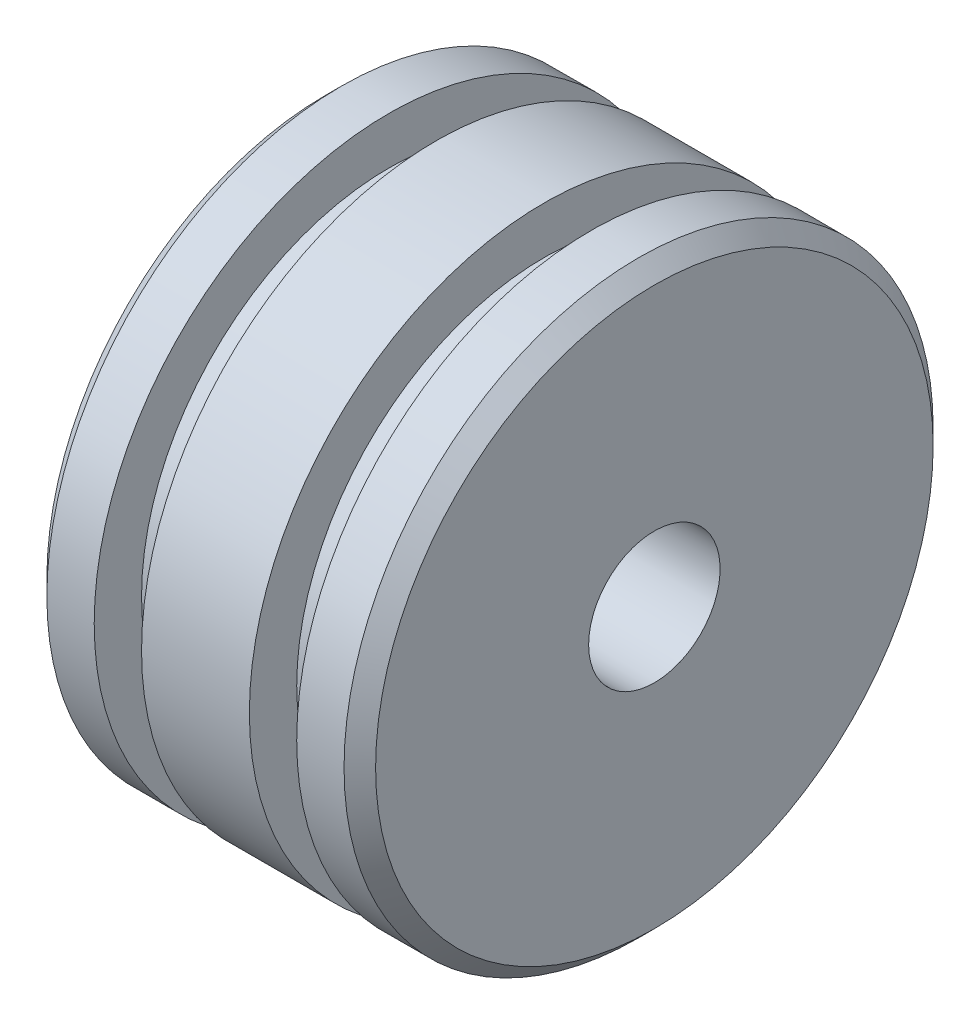
ISO-10303-21;
HEADER;
FILE_DESCRIPTION(('STEP AP214'),'2;1');
FILE_NAME('part.step','',(''),(''),'','','');
FILE_SCHEMA(('AUTOMOTIVE_DESIGN { 1 0 10303 214 1 1 1 1 }'));
ENDSEC;
DATA;
#1=APPLICATION_CONTEXT('core data for automotive mechanical design processes');
#2=APPLICATION_PROTOCOL_DEFINITION('international standard','automotive_design',2000,#1);
#3=PRODUCT_CONTEXT('',#1,'mechanical');
#4=PRODUCT('Part','Part','',(#3));
#5=PRODUCT_RELATED_PRODUCT_CATEGORY('part','',(#4));
#6=PRODUCT_DEFINITION_FORMATION('','',#4);
#7=PRODUCT_DEFINITION_CONTEXT('part definition',#1,'design');
#8=PRODUCT_DEFINITION('design','',#6,#7);
#9=PRODUCT_DEFINITION_SHAPE('','',#8);
#10=(LENGTH_UNIT() NAMED_UNIT(*) SI_UNIT(.MILLI.,.METRE.));
#11=(NAMED_UNIT(*) PLANE_ANGLE_UNIT() SI_UNIT($,.RADIAN.));
#12=(NAMED_UNIT(*) SI_UNIT($,.STERADIAN.) SOLID_ANGLE_UNIT());
#13=UNCERTAINTY_MEASURE_WITH_UNIT(LENGTH_MEASURE(1.E-05),#10,'distance_accuracy_value','');
#14=(GEOMETRIC_REPRESENTATION_CONTEXT(3) GLOBAL_UNCERTAINTY_ASSIGNED_CONTEXT((#13)) GLOBAL_UNIT_ASSIGNED_CONTEXT((#10,
#11,#12)) REPRESENTATION_CONTEXT('',''));
#15=CARTESIAN_POINT('',(0.,0.,0.));
#16=DIRECTION('',(0.,0.,1.));
#17=DIRECTION('',(1.,0.,0.));
#18=AXIS2_PLACEMENT_3D('',#15,#16,#17);
#19=CARTESIAN_POINT('',(15.875,0.,0.));
#20=DIRECTION('',(-1.,0.,0.));
#21=DIRECTION('',(0.,0.,1.));
#22=AXIS2_PLACEMENT_3D('',#19,#20,#21);
#23=CYLINDRICAL_SURFACE('',#22,14.224);
#24=CARTESIAN_POINT('',(5.334,0.,0.));
#25=DIRECTION('',(-1.,0.,0.));
#26=DIRECTION('',(0.,0.,1.));
#27=AXIS2_PLACEMENT_3D('',#24,#25,#26);
#28=CIRCLE('',#27,14.224);
#29=CARTESIAN_POINT('',(5.334,0.,14.224));
#30=VERTEX_POINT('',#29);
#31=EDGE_CURVE('E62',#30,#30,#28,.T.);
#32=ORIENTED_EDGE('',*,*,#31,.F.);
#33=EDGE_LOOP('',(#32));
#34=FACE_BOUND('',#33,.T.);
#35=CARTESIAN_POINT('',(10.541,0.,0.));
#36=DIRECTION('',(-1.,0.,0.));
#37=DIRECTION('',(0.,0.,1.));
#38=AXIS2_PLACEMENT_3D('',#35,#36,#37);
#39=CIRCLE('',#38,14.224);
#40=CARTESIAN_POINT('',(10.541,0.,14.224));
#41=VERTEX_POINT('',#40);
#42=EDGE_CURVE('E72',#41,#41,#39,.T.);
#43=ORIENTED_EDGE('',*,*,#42,.T.);
#44=EDGE_LOOP('',(#43));
#45=FACE_BOUND('',#44,.T.);
#46=ADVANCED_FACE('F32',(#34,#45),#23,.T.);
#47=CARTESIAN_POINT('',(0.762000000000013,0.,0.));
#48=DIRECTION('',(1.,0.,0.));
#49=DIRECTION('',(0.,0.,-1.));
#50=AXIS2_PLACEMENT_3D('',#47,#48,#49);
#51=CIRCLE('',#50,14.224);
#52=CARTESIAN_POINT('',(0.762000000000013,0.,-14.224));
#53=VERTEX_POINT('',#52);
#54=EDGE_CURVE('E40',#53,#53,#51,.T.);
#55=ORIENTED_EDGE('',*,*,#54,.T.);
#56=EDGE_LOOP('',(#55));
#57=FACE_BOUND('',#56,.T.);
#58=CARTESIAN_POINT('',(3.048,0.,0.));
#59=DIRECTION('',(-1.,0.,0.));
#60=DIRECTION('',(0.,0.,1.));
#61=AXIS2_PLACEMENT_3D('',#58,#59,#60);
#62=CIRCLE('',#61,14.224);
#63=CARTESIAN_POINT('',(3.048,0.,14.224));
#64=VERTEX_POINT('',#63);
#65=EDGE_CURVE('E59',#64,#64,#62,.T.);
#66=ORIENTED_EDGE('',*,*,#65,.T.);
#67=EDGE_LOOP('',(#66));
#68=FACE_BOUND('',#67,.T.);
#69=ADVANCED_FACE('F105',(#57,#68),#23,.T.);
#70=CARTESIAN_POINT('',(0.,0.,0.));
#71=DIRECTION('',(1.,0.,0.));
#72=DIRECTION('',(0.,0.,-1.));
#73=AXIS2_PLACEMENT_3D('',#70,#71,#72);
#74=PLANE('',#73);
#75=CARTESIAN_POINT('',(0.,0.,0.));
#76=DIRECTION('',(1.,0.,0.));
#77=DIRECTION('',(0.,0.,-1.));
#78=AXIS2_PLACEMENT_3D('',#75,#76,#77);
#79=CIRCLE('',#78,13.462);
#80=CARTESIAN_POINT('',(0.,0.,-13.462));
#81=VERTEX_POINT('',#80);
#82=EDGE_CURVE('E10',#81,#81,#79,.F.);
#83=ORIENTED_EDGE('',*,*,#82,.T.);
#84=EDGE_LOOP('',(#83));
#85=FACE_BOUND('',#84,.T.);
#86=CARTESIAN_POINT('',(0.,0.,0.));
#87=DIRECTION('',(-1.,0.,0.));
#88=DIRECTION('',(0.,0.,1.));
#89=AXIS2_PLACEMENT_3D('',#86,#87,#88);
#90=CIRCLE('',#89,3.175);
#91=CARTESIAN_POINT('',(0.,0.,3.175));
#92=VERTEX_POINT('',#91);
#93=EDGE_CURVE('E85',#92,#92,#90,.T.);
#94=ORIENTED_EDGE('',*,*,#93,.F.);
#95=EDGE_LOOP('',(#94));
#96=FACE_BOUND('',#95,.T.);
#97=ADVANCED_FACE('F102',(#85,#96),#74,.F.);
#98=CARTESIAN_POINT('',(3.048,14.224,0.));
#99=DIRECTION('',(1.,0.,0.));
#100=DIRECTION('',(0.,0.,-1.));
#101=AXIS2_PLACEMENT_3D('',#98,#99,#100);
#102=PLANE('',#101);
#103=CARTESIAN_POINT('',(3.048,0.,0.));
#104=DIRECTION('',(-1.,0.,0.));
#105=DIRECTION('',(0.,0.,1.));
#106=AXIS2_PLACEMENT_3D('',#103,#104,#105);
#107=CIRCLE('',#106,11.938);
#108=CARTESIAN_POINT('',(3.048,0.,11.938));
#109=VERTEX_POINT('',#108);
#110=EDGE_CURVE('E69',#109,#109,#107,.T.);
#111=ORIENTED_EDGE('',*,*,#110,.T.);
#112=EDGE_LOOP('',(#111));
#113=FACE_BOUND('',#112,.T.);
#114=ORIENTED_EDGE('',*,*,#65,.F.);
#115=EDGE_LOOP('',(#114));
#116=FACE_BOUND('',#115,.T.);
#117=ADVANCED_FACE('F104',(#113,#116),#102,.T.);
#118=CARTESIAN_POINT('',(5.334,11.938,0.));
#119=DIRECTION('',(-1.,0.,0.));
#120=DIRECTION('',(0.,0.,1.));
#121=AXIS2_PLACEMENT_3D('',#118,#119,#120);
#122=PLANE('',#121);
#123=ORIENTED_EDGE('',*,*,#31,.T.);
#124=EDGE_LOOP('',(#123));
#125=FACE_BOUND('',#124,.T.);
#126=CARTESIAN_POINT('',(5.334,0.,0.));
#127=DIRECTION('',(-1.,0.,0.));
#128=DIRECTION('',(0.,0.,1.));
#129=AXIS2_PLACEMENT_3D('',#126,#127,#128);
#130=CIRCLE('',#129,11.938);
#131=CARTESIAN_POINT('',(5.334,0.,11.938));
#132=VERTEX_POINT('',#131);
#133=EDGE_CURVE('E65',#132,#132,#130,.T.);
#134=ORIENTED_EDGE('',*,*,#133,.F.);
#135=EDGE_LOOP('',(#134));
#136=FACE_BOUND('',#135,.T.);
#137=ADVANCED_FACE('F111',(#125,#136),#122,.T.);
#138=CARTESIAN_POINT('',(0.,0.,0.));
#139=DIRECTION('',(-1.,0.,0.));
#140=DIRECTION('',(0.,0.,1.));
#141=AXIS2_PLACEMENT_3D('',#138,#139,#140);
#142=CYLINDRICAL_SURFACE('',#141,11.938);
#143=ORIENTED_EDGE('',*,*,#110,.F.);
#144=EDGE_LOOP('',(#143));
#145=FACE_BOUND('',#144,.T.);
#146=ORIENTED_EDGE('',*,*,#133,.T.);
#147=EDGE_LOOP('',(#146));
#148=FACE_BOUND('',#147,.T.);
#149=ADVANCED_FACE('F149',(#145,#148),#142,.T.);
#150=CARTESIAN_POINT('',(10.541,14.224,0.));
#151=DIRECTION('',(1.,0.,0.));
#152=DIRECTION('',(0.,0.,-1.));
#153=AXIS2_PLACEMENT_3D('',#150,#151,#152);
#154=PLANE('',#153);
#155=CARTESIAN_POINT('',(10.541,0.,0.));
#156=DIRECTION('',(-1.,0.,0.));
#157=DIRECTION('',(0.,0.,1.));
#158=AXIS2_PLACEMENT_3D('',#155,#156,#157);
#159=CIRCLE('',#158,11.938);
#160=CARTESIAN_POINT('',(10.541,0.,11.938));
#161=VERTEX_POINT('',#160);
#162=EDGE_CURVE('E81',#161,#161,#159,.T.);
#163=ORIENTED_EDGE('',*,*,#162,.T.);
#164=EDGE_LOOP('',(#163));
#165=FACE_BOUND('',#164,.T.);
#166=ORIENTED_EDGE('',*,*,#42,.F.);
#167=EDGE_LOOP('',(#166));
#168=FACE_BOUND('',#167,.T.);
#169=ADVANCED_FACE('F136',(#165,#168),#154,.T.);
#170=CARTESIAN_POINT('',(12.827,11.938,0.));
#171=DIRECTION('',(-1.,0.,0.));
#172=DIRECTION('',(0.,0.,1.));
#173=AXIS2_PLACEMENT_3D('',#170,#171,#172);
#174=PLANE('',#173);
#175=CARTESIAN_POINT('',(12.827,0.,0.));
#176=DIRECTION('',(-1.,0.,0.));
#177=DIRECTION('',(0.,0.,1.));
#178=AXIS2_PLACEMENT_3D('',#175,#176,#177);
#179=CIRCLE('',#178,14.224);
#180=CARTESIAN_POINT('',(12.827,0.,14.224));
#181=VERTEX_POINT('',#180);
#182=EDGE_CURVE('E75',#181,#181,#179,.T.);
#183=ORIENTED_EDGE('',*,*,#182,.T.);
#184=EDGE_LOOP('',(#183));
#185=FACE_BOUND('',#184,.T.);
#186=CARTESIAN_POINT('',(12.827,0.,0.));
#187=DIRECTION('',(-1.,0.,0.));
#188=DIRECTION('',(0.,0.,1.));
#189=AXIS2_PLACEMENT_3D('',#186,#187,#188);
#190=CIRCLE('',#189,11.938);
#191=CARTESIAN_POINT('',(12.827,0.,11.938));
#192=VERTEX_POINT('',#191);
#193=EDGE_CURVE('E78',#192,#192,#190,.T.);
#194=ORIENTED_EDGE('',*,*,#193,.F.);
#195=EDGE_LOOP('',(#194));
#196=FACE_BOUND('',#195,.T.);
#197=ADVANCED_FACE('F133',(#185,#196),#174,.T.);
#198=CARTESIAN_POINT('',(0.,0.,0.));
#199=DIRECTION('',(-1.,0.,0.));
#200=DIRECTION('',(0.,0.,1.));
#201=AXIS2_PLACEMENT_3D('',#198,#199,#200);
#202=CYLINDRICAL_SURFACE('',#201,11.938);
#203=ORIENTED_EDGE('',*,*,#162,.F.);
#204=EDGE_LOOP('',(#203));
#205=FACE_BOUND('',#204,.T.);
#206=ORIENTED_EDGE('',*,*,#193,.T.);
#207=EDGE_LOOP('',(#206));
#208=FACE_BOUND('',#207,.T.);
#209=ADVANCED_FACE('F127',(#205,#208),#202,.T.);
#210=CARTESIAN_POINT('',(15.875,0.,0.));
#211=DIRECTION('',(1.,0.,0.));
#212=DIRECTION('',(0.,0.,-1.));
#213=AXIS2_PLACEMENT_3D('',#210,#211,#212);
#214=PLANE('',#213);
#215=CARTESIAN_POINT('',(15.875,0.,0.));
#216=DIRECTION('',(1.,0.,0.));
#217=DIRECTION('',(0.,0.,-1.));
#218=AXIS2_PLACEMENT_3D('',#215,#216,#217);
#219=CIRCLE('',#218,13.462);
#220=CARTESIAN_POINT('',(15.875,0.,-13.462));
#221=VERTEX_POINT('',#220);
#222=EDGE_CURVE('E54',#221,#221,#219,.T.);
#223=ORIENTED_EDGE('',*,*,#222,.T.);
#224=EDGE_LOOP('',(#223));
#225=FACE_BOUND('',#224,.T.);
#226=CARTESIAN_POINT('',(15.875,0.,0.));
#227=DIRECTION('',(-1.,0.,0.));
#228=DIRECTION('',(0.,0.,1.));
#229=AXIS2_PLACEMENT_3D('',#226,#227,#228);
#230=CIRCLE('',#229,3.175);
#231=CARTESIAN_POINT('',(15.875,0.,3.175));
#232=VERTEX_POINT('',#231);
#233=EDGE_CURVE('E84',#232,#232,#230,.T.);
#234=ORIENTED_EDGE('',*,*,#233,.T.);
#235=EDGE_LOOP('',(#234));
#236=FACE_BOUND('',#235,.T.);
#237=ADVANCED_FACE('F92',(#225,#236),#214,.T.);
#238=CARTESIAN_POINT('',(15.113,0.,0.));
#239=DIRECTION('',(1.,0.,0.));
#240=DIRECTION('',(0.,0.,-1.));
#241=AXIS2_PLACEMENT_3D('',#238,#239,#240);
#242=CIRCLE('',#241,14.224);
#243=CARTESIAN_POINT('',(15.113,0.,-14.224));
#244=VERTEX_POINT('',#243);
#245=EDGE_CURVE('E48',#244,#244,#242,.F.);
#246=ORIENTED_EDGE('',*,*,#245,.T.);
#247=EDGE_LOOP('',(#246));
#248=FACE_BOUND('',#247,.T.);
#249=ORIENTED_EDGE('',*,*,#182,.F.);
#250=EDGE_LOOP('',(#249));
#251=FACE_BOUND('',#250,.T.);
#252=ADVANCED_FACE('F98',(#248,#251),#23,.T.);
#253=CARTESIAN_POINT('',(15.875,0.,0.));
#254=DIRECTION('',(-1.,0.,0.));
#255=DIRECTION('',(0.,0.,1.));
#256=AXIS2_PLACEMENT_3D('',#253,#254,#255);
#257=CYLINDRICAL_SURFACE('',#256,3.175);
#258=ORIENTED_EDGE('',*,*,#233,.F.);
#259=EDGE_LOOP('',(#258));
#260=FACE_BOUND('',#259,.T.);
#261=ORIENTED_EDGE('',*,*,#93,.T.);
#262=EDGE_LOOP('',(#261));
#263=FACE_BOUND('',#262,.T.);
#264=ADVANCED_FACE('F94',(#260,#263),#257,.F.);
#265=CARTESIAN_POINT('',(15.875,0.,0.));
#266=DIRECTION('',(-1.,0.,0.));
#267=DIRECTION('',(0.,0.,1.));
#268=AXIS2_PLACEMENT_3D('',#265,#266,#267);
#269=CONICAL_SURFACE('',#268,13.462,0.785398163397453);
#270=ORIENTED_EDGE('',*,*,#245,.F.);
#271=EDGE_LOOP('',(#270));
#272=FACE_BOUND('',#271,.T.);
#273=ORIENTED_EDGE('',*,*,#222,.F.);
#274=EDGE_LOOP('',(#273));
#275=FACE_BOUND('',#274,.T.);
#276=ADVANCED_FACE('F97',(#272,#275),#269,.T.);
#277=CARTESIAN_POINT('',(0.762000000000013,0.,0.));
#278=DIRECTION('',(1.,0.,0.));
#279=DIRECTION('',(0.,0.,-1.));
#280=AXIS2_PLACEMENT_3D('',#277,#278,#279);
#281=CONICAL_SURFACE('',#280,14.224,0.785398163397444);
#282=CARTESIAN_POINT('',(0.,0.,-13.462));
#283=CARTESIAN_POINT('',(0.00793750000000043,0.,-13.4699375));
#284=CARTESIAN_POINT('',(0.0158750000000004,0.,-13.477875));
#285=CARTESIAN_POINT('',(0.0317500000000004,0.,-13.49375));
#286=CARTESIAN_POINT('',(0.0396875000000004,0.,-13.5016875));
#287=CARTESIAN_POINT('',(0.0555625000000006,0.,-13.5175625));
#288=CARTESIAN_POINT('',(0.0635000000000008,0.,-13.5255));
#289=CARTESIAN_POINT('',(0.0793750000000013,0.,-13.541375));
#290=CARTESIAN_POINT('',(0.0873125000000015,0.,-13.5493125));
#291=CARTESIAN_POINT('',(0.103187500000002,0.,-13.5651875));
#292=CARTESIAN_POINT('',(0.111125000000002,0.,-13.573125));
#293=CARTESIAN_POINT('',(0.127000000000002,0.,-13.589));
#294=CARTESIAN_POINT('',(0.134937500000002,0.,-13.5969375));
#295=CARTESIAN_POINT('',(0.150812500000003,0.,-13.6128125));
#296=CARTESIAN_POINT('',(0.158750000000002,0.,-13.62075));
#297=CARTESIAN_POINT('',(0.174625000000003,0.,-13.636625));
#298=CARTESIAN_POINT('',(0.182562500000003,0.,-13.6445625));
#299=CARTESIAN_POINT('',(0.198437500000003,0.,-13.6604375));
#300=CARTESIAN_POINT('',(0.206375000000004,0.,-13.668375));
#301=CARTESIAN_POINT('',(0.222250000000004,0.,-13.68425));
#302=CARTESIAN_POINT('',(0.230187500000004,0.,-13.6921875));
#303=CARTESIAN_POINT('',(0.246062500000004,0.,-13.7080625));
#304=CARTESIAN_POINT('',(0.254000000000004,0.,-13.716));
#305=CARTESIAN_POINT('',(0.269875000000004,0.,-13.731875));
#306=CARTESIAN_POINT('',(0.277812500000005,0.,-13.7398125));
#307=CARTESIAN_POINT('',(0.293687500000005,0.,-13.7556875));
#308=CARTESIAN_POINT('',(0.301625000000005,0.,-13.763625));
#309=CARTESIAN_POINT('',(0.317500000000005,0.,-13.7795));
#310=CARTESIAN_POINT('',(0.325437500000005,0.,-13.7874375));
#311=CARTESIAN_POINT('',(0.341312500000006,0.,-13.8033125));
#312=CARTESIAN_POINT('',(0.349250000000006,0.,-13.81125));
#313=CARTESIAN_POINT('',(0.365125000000006,0.,-13.827125));
#314=CARTESIAN_POINT('',(0.373062500000006,0.,-13.8350625));
#315=CARTESIAN_POINT('',(0.388937500000007,0.,-13.8509375));
#316=CARTESIAN_POINT('',(0.396875000000007,0.,-13.858875));
#317=CARTESIAN_POINT('',(0.412750000000007,0.,-13.87475));
#318=CARTESIAN_POINT('',(0.420687500000007,0.,-13.8826875));
#319=CARTESIAN_POINT('',(0.436562500000007,0.,-13.8985625));
#320=CARTESIAN_POINT('',(0.444500000000007,0.,-13.9065));
#321=CARTESIAN_POINT('',(0.460375000000008,0.,-13.922375));
#322=CARTESIAN_POINT('',(0.468312500000008,0.,-13.9303125));
#323=CARTESIAN_POINT('',(0.484187500000008,0.,-13.9461875));
#324=CARTESIAN_POINT('',(0.492125000000008,0.,-13.954125));
#325=CARTESIAN_POINT('',(0.508000000000008,0.,-13.97));
#326=CARTESIAN_POINT('',(0.515937500000009,0.,-13.9779375));
#327=CARTESIAN_POINT('',(0.531812500000009,0.,-13.9938125));
#328=CARTESIAN_POINT('',(0.539750000000009,0.,-14.00175));
#329=CARTESIAN_POINT('',(0.555625000000009,0.,-14.017625));
#330=CARTESIAN_POINT('',(0.563562500000009,0.,-14.0255625));
#331=CARTESIAN_POINT('',(0.57943750000001,0.,-14.0414375));
#332=CARTESIAN_POINT('',(0.58737500000001,0.,-14.049375));
#333=CARTESIAN_POINT('',(0.60325000000001,0.,-14.06525));
#334=CARTESIAN_POINT('',(0.61118750000001,0.,-14.0731875));
#335=CARTESIAN_POINT('',(0.62706250000001,0.,-14.0890625));
#336=CARTESIAN_POINT('',(0.63500000000001,0.,-14.097));
#337=CARTESIAN_POINT('',(0.650875000000011,0.,-14.112875));
#338=CARTESIAN_POINT('',(0.658812500000011,0.,-14.1208125));
#339=CARTESIAN_POINT('',(0.674687500000011,0.,-14.1366875));
#340=CARTESIAN_POINT('',(0.682625000000011,0.,-14.144625));
#341=CARTESIAN_POINT('',(0.698500000000012,0.,-14.1605));
#342=CARTESIAN_POINT('',(0.706437500000012,0.,-14.1684375));
#343=CARTESIAN_POINT('',(0.722312500000012,0.,-14.1843125));
#344=CARTESIAN_POINT('',(0.730250000000012,0.,-14.19225));
#345=CARTESIAN_POINT('',(0.746125000000012,0.,-14.208125));
#346=CARTESIAN_POINT('',(0.754062500000012,0.,-14.2160625));
#347=CARTESIAN_POINT('',(0.762000000000013,0.,-14.224));
#348=B_SPLINE_CURVE_WITH_KNOTS('',3,(#282,#283,#284,#285,#286,#287,#288,#289,#290,#291,#292,
#293,#294,#295,#296,#297,#298,#299,#300,#301,#302,#303,#304,#305,#306,#307,#308,#309,#310,#311,
#312,#313,#314,#315,#316,#317,#318,#319,#320,#321,#322,#323,#324,#325,#326,#327,#328,#329,#330,
#331,#332,#333,#334,#335,#336,#337,#338,#339,#340,#341,#342,#343,#344,#345,#346,#347),
.UNSPECIFIED.,.F.,.F.,(4,2,2,2,2,2,2,2,2,2,2,2,2,2,2,2,2,2,2,2,2,2,2,2,2,2,2,2,2,2,2,2,4),(0.,
0.0336759604540093,0.0673519209080198,0.101027881362029,0.134703841816038,0.168379802270049,
0.202055762724058,0.235731723178069,0.269407683632078,0.303083644086087,0.336759604540098,
0.370435564994107,0.404111525448116,0.437787485902127,0.471463446356136,0.505139406810146,
0.538815367264156,0.572491327718165,0.606167288172175,0.639843248626185,0.673519209080194,
0.707195169534204,0.740871129988214,0.774547090442224,0.808223050896234,0.841899011350243,
0.875574971804253,0.909250932258263,0.942926892712272,0.976602853166282,1.01027881362029,
1.0439547740743,1.07763073452831),.UNSPECIFIED.);
#349=EDGE_CURVE('BSEAM34',#81,#53,#348,.T.);
#350=ORIENTED_EDGE('',*,*,#82,.F.);
#351=ORIENTED_EDGE('',*,*,#54,.F.);
#352=ORIENTED_EDGE('',*,*,#349,.T.);
#353=ORIENTED_EDGE('',*,*,#349,.F.);
#354=EDGE_LOOP('',(#350,#352,#351,#353));
#355=FACE_BOUND('',#354,.T.);
#356=ADVANCED_FACE('F34',(#355),#281,.T.);
#357=CLOSED_SHELL('',(#46,#69,#97,#117,#137,#149,#169,#197,#209,#237,#252,#264,#276,#356));
#358=MANIFOLD_SOLID_BREP('B2',#357);
#359=ADVANCED_BREP_SHAPE_REPRESENTATION('',(#18,#358),#14);
#360=SHAPE_DEFINITION_REPRESENTATION(#9,#359);
ENDSEC;
END-ISO-10303-21;
